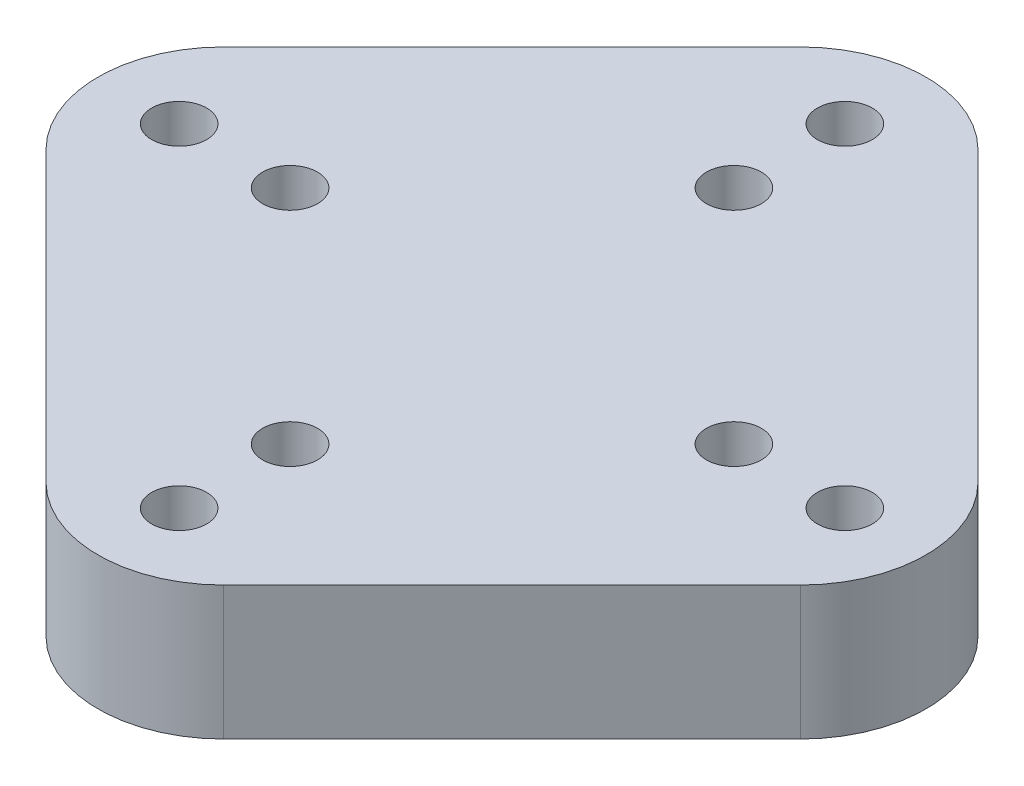
ISO-10303-21;
HEADER;
FILE_DESCRIPTION(('STEP AP214'),'2;1');
FILE_NAME('part.step','',(''),(''),'','','');
FILE_SCHEMA(('AUTOMOTIVE_DESIGN { 1 0 10303 214 1 1 1 1 }'));
ENDSEC;
DATA;
#1=APPLICATION_CONTEXT('core data for automotive mechanical design processes');
#2=APPLICATION_PROTOCOL_DEFINITION('international standard','automotive_design',2000,#1);
#3=PRODUCT_CONTEXT('',#1,'mechanical');
#4=PRODUCT('Part','Part','',(#3));
#5=PRODUCT_RELATED_PRODUCT_CATEGORY('part','',(#4));
#6=PRODUCT_DEFINITION_FORMATION('','',#4);
#7=PRODUCT_DEFINITION_CONTEXT('part definition',#1,'design');
#8=PRODUCT_DEFINITION('design','',#6,#7);
#9=PRODUCT_DEFINITION_SHAPE('','',#8);
#10=(LENGTH_UNIT() NAMED_UNIT(*) SI_UNIT(.MILLI.,.METRE.));
#11=(NAMED_UNIT(*) PLANE_ANGLE_UNIT() SI_UNIT($,.RADIAN.));
#12=(NAMED_UNIT(*) SI_UNIT($,.STERADIAN.) SOLID_ANGLE_UNIT());
#13=UNCERTAINTY_MEASURE_WITH_UNIT(LENGTH_MEASURE(1.E-05),#10,'distance_accuracy_value','');
#14=(GEOMETRIC_REPRESENTATION_CONTEXT(3) GLOBAL_UNCERTAINTY_ASSIGNED_CONTEXT((#13)) GLOBAL_UNIT_ASSIGNED_CONTEXT((#10,
#11,#12)) REPRESENTATION_CONTEXT('',''));
#15=CARTESIAN_POINT('',(0.,0.,0.));
#16=DIRECTION('',(0.,0.,1.));
#17=DIRECTION('',(1.,0.,0.));
#18=AXIS2_PLACEMENT_3D('',#15,#16,#17);
#19=CARTESIAN_POINT('',(18.3847763108502,8.5,0.));
#20=DIRECTION('',(0.,-1.,0.));
#21=DIRECTION('',(0.,0.,-1.));
#22=AXIS2_PLACEMENT_3D('',#19,#20,#21);
#23=PLANE('',#22);
#24=CARTESIAN_POINT('',(18.3847763108502,8.5,0.));
#25=DIRECTION('',(0.,1.,0.));
#26=DIRECTION('',(0.,0.,-1.));
#27=AXIS2_PLACEMENT_3D('',#24,#25,#26);
#28=CIRCLE('',#27,8.);
#29=CARTESIAN_POINT('',(24.0416305603426,8.5,5.65685424949242));
#30=VERTEX_POINT('',#29);
#31=CARTESIAN_POINT('',(24.0416305603426,8.5,-5.65685424949242));
#32=VERTEX_POINT('',#31);
#33=EDGE_CURVE('E148',#30,#32,#28,.T.);
#34=ORIENTED_EDGE('',*,*,#33,.T.);
#35=DIRECTION('',(-0.707106781186548,0.,-0.707106781186547));
#36=VECTOR('',#35,1.);
#37=CARTESIAN_POINT('',(24.0416305603426,8.5,-5.65685424949242));
#38=LINE('',#37,#36);
#39=CARTESIAN_POINT('',(5.65685424949241,8.5,-24.0416305603426));
#40=VERTEX_POINT('',#39);
#41=EDGE_CURVE('E96',#32,#40,#38,.T.);
#42=ORIENTED_EDGE('',*,*,#41,.T.);
#43=CARTESIAN_POINT('',(0.,8.5,-18.3847763108502));
#44=DIRECTION('',(0.,1.,0.));
#45=DIRECTION('',(0.,0.,-1.));
#46=AXIS2_PLACEMENT_3D('',#43,#44,#45);
#47=CIRCLE('',#46,8.);
#48=CARTESIAN_POINT('',(-5.65685424949243,8.5,-24.0416305603426));
#49=VERTEX_POINT('',#48);
#50=EDGE_CURVE('E163',#40,#49,#47,.T.);
#51=ORIENTED_EDGE('',*,*,#50,.T.);
#52=DIRECTION('',(-0.707106781186547,0.,0.707106781186548));
#53=VECTOR('',#52,1.);
#54=CARTESIAN_POINT('',(-5.65685424949243,8.5,-24.0416305603426));
#55=LINE('',#54,#53);
#56=CARTESIAN_POINT('',(-24.0416305603426,8.5,-5.65685424949241));
#57=VERTEX_POINT('',#56);
#58=EDGE_CURVE('E176',#49,#57,#55,.T.);
#59=ORIENTED_EDGE('',*,*,#58,.T.);
#60=CARTESIAN_POINT('',(-18.3847763108502,8.5,0.));
#61=DIRECTION('',(0.,1.,0.));
#62=DIRECTION('',(0.,0.,-1.));
#63=AXIS2_PLACEMENT_3D('',#60,#61,#62);
#64=CIRCLE('',#63,8.);
#65=CARTESIAN_POINT('',(-24.0416305603426,8.5,5.65685424949243));
#66=VERTEX_POINT('',#65);
#67=EDGE_CURVE('E115',#57,#66,#64,.T.);
#68=ORIENTED_EDGE('',*,*,#67,.T.);
#69=DIRECTION('',(0.707106781186548,0.,0.707106781186547));
#70=VECTOR('',#69,1.);
#71=CARTESIAN_POINT('',(-24.0416305603426,8.5,5.65685424949243));
#72=LINE('',#71,#70);
#73=CARTESIAN_POINT('',(-5.65685424949241,8.5,24.0416305603426));
#74=VERTEX_POINT('',#73);
#75=EDGE_CURVE('E109',#66,#74,#72,.T.);
#76=ORIENTED_EDGE('',*,*,#75,.T.);
#77=CARTESIAN_POINT('',(0.,8.5,18.3847763108502));
#78=DIRECTION('',(0.,1.,0.));
#79=DIRECTION('',(0.,0.,-1.));
#80=AXIS2_PLACEMENT_3D('',#77,#78,#79);
#81=CIRCLE('',#80,8.);
#82=CARTESIAN_POINT('',(5.65685424949243,8.5,24.0416305603426));
#83=VERTEX_POINT('',#82);
#84=EDGE_CURVE('E113',#74,#83,#81,.T.);
#85=ORIENTED_EDGE('',*,*,#84,.T.);
#86=DIRECTION('',(0.707106781186547,0.,-0.707106781186548));
#87=VECTOR('',#86,1.);
#88=CARTESIAN_POINT('',(5.65685424949243,8.5,24.0416305603426));
#89=LINE('',#88,#87);
#90=EDGE_CURVE('E53',#83,#30,#89,.T.);
#91=ORIENTED_EDGE('',*,*,#90,.T.);
#92=EDGE_LOOP('',(#34,#42,#51,#59,#68,#76,#85,#91));
#93=FACE_BOUND('',#92,.T.);
#94=CARTESIAN_POINT('',(21.2132034355964,8.5,0.));
#95=DIRECTION('',(0.,1.,0.));
#96=DIRECTION('',(0.,0.,1.));
#97=AXIS2_PLACEMENT_3D('',#94,#95,#96);
#98=CIRCLE('',#97,1.75);
#99=CARTESIAN_POINT('',(21.2132034355964,8.5,1.75));
#100=VERTEX_POINT('',#99);
#101=EDGE_CURVE('E137',#100,#100,#98,.T.);
#102=ORIENTED_EDGE('',*,*,#101,.F.);
#103=EDGE_LOOP('',(#102));
#104=FACE_BOUND('',#103,.T.);
#105=CARTESIAN_POINT('',(14.142135623731,8.5,0.));
#106=DIRECTION('',(0.,1.,0.));
#107=DIRECTION('',(0.,0.,1.));
#108=AXIS2_PLACEMENT_3D('',#105,#106,#107);
#109=CIRCLE('',#108,1.75);
#110=CARTESIAN_POINT('',(14.142135623731,8.5,1.75));
#111=VERTEX_POINT('',#110);
#112=EDGE_CURVE('E185',#111,#111,#109,.T.);
#113=ORIENTED_EDGE('',*,*,#112,.F.);
#114=EDGE_LOOP('',(#113));
#115=FACE_BOUND('',#114,.T.);
#116=CARTESIAN_POINT('',(0.,8.5,21.2132034355964));
#117=DIRECTION('',(0.,1.,0.));
#118=DIRECTION('',(0.,0.,1.));
#119=AXIS2_PLACEMENT_3D('',#116,#117,#118);
#120=CIRCLE('',#119,1.75);
#121=CARTESIAN_POINT('',(0.,8.5,22.9632034355964));
#122=VERTEX_POINT('',#121);
#123=EDGE_CURVE('E191',#122,#122,#120,.T.);
#124=ORIENTED_EDGE('',*,*,#123,.F.);
#125=EDGE_LOOP('',(#124));
#126=FACE_BOUND('',#125,.T.);
#127=CARTESIAN_POINT('',(0.,8.5,14.142135623731));
#128=DIRECTION('',(0.,1.,0.));
#129=DIRECTION('',(0.,0.,1.));
#130=AXIS2_PLACEMENT_3D('',#127,#128,#129);
#131=CIRCLE('',#130,1.75);
#132=CARTESIAN_POINT('',(0.,8.5,15.892135623731));
#133=VERTEX_POINT('',#132);
#134=EDGE_CURVE('E197',#133,#133,#131,.T.);
#135=ORIENTED_EDGE('',*,*,#134,.F.);
#136=EDGE_LOOP('',(#135));
#137=FACE_BOUND('',#136,.T.);
#138=CARTESIAN_POINT('',(-21.2132034355964,8.5,0.));
#139=DIRECTION('',(0.,1.,0.));
#140=DIRECTION('',(0.,0.,1.));
#141=AXIS2_PLACEMENT_3D('',#138,#139,#140);
#142=CIRCLE('',#141,1.75);
#143=CARTESIAN_POINT('',(-21.2132034355964,8.5,1.75));
#144=VERTEX_POINT('',#143);
#145=EDGE_CURVE('E203',#144,#144,#142,.T.);
#146=ORIENTED_EDGE('',*,*,#145,.F.);
#147=EDGE_LOOP('',(#146));
#148=FACE_BOUND('',#147,.T.);
#149=CARTESIAN_POINT('',(-14.142135623731,8.5,0.));
#150=DIRECTION('',(0.,1.,0.));
#151=DIRECTION('',(0.,0.,1.));
#152=AXIS2_PLACEMENT_3D('',#149,#150,#151);
#153=CIRCLE('',#152,1.75);
#154=CARTESIAN_POINT('',(-14.142135623731,8.5,1.75));
#155=VERTEX_POINT('',#154);
#156=EDGE_CURVE('E209',#155,#155,#153,.T.);
#157=ORIENTED_EDGE('',*,*,#156,.F.);
#158=EDGE_LOOP('',(#157));
#159=FACE_BOUND('',#158,.T.);
#160=CARTESIAN_POINT('',(0.,8.5,-21.2132034355964));
#161=DIRECTION('',(0.,1.,0.));
#162=DIRECTION('',(0.,0.,1.));
#163=AXIS2_PLACEMENT_3D('',#160,#161,#162);
#164=CIRCLE('',#163,1.75);
#165=CARTESIAN_POINT('',(0.,8.5,-19.4632034355964));
#166=VERTEX_POINT('',#165);
#167=EDGE_CURVE('E215',#166,#166,#164,.T.);
#168=ORIENTED_EDGE('',*,*,#167,.F.);
#169=EDGE_LOOP('',(#168));
#170=FACE_BOUND('',#169,.T.);
#171=CARTESIAN_POINT('',(0.,8.5,-14.142135623731));
#172=DIRECTION('',(0.,1.,0.));
#173=DIRECTION('',(0.,0.,1.));
#174=AXIS2_PLACEMENT_3D('',#171,#172,#173);
#175=CIRCLE('',#174,1.75);
#176=CARTESIAN_POINT('',(0.,8.5,-12.392135623731));
#177=VERTEX_POINT('',#176);
#178=EDGE_CURVE('E221',#177,#177,#175,.T.);
#179=ORIENTED_EDGE('',*,*,#178,.F.);
#180=EDGE_LOOP('',(#179));
#181=FACE_BOUND('',#180,.T.);
#182=ADVANCED_FACE('F36',(#93,#104,#115,#126,#137,#148,#159,#170,#181),#23,.F.);
#183=CARTESIAN_POINT('',(18.3847763108502,0.,0.));
#184=DIRECTION('',(0.,-1.,0.));
#185=DIRECTION('',(0.,0.,-1.));
#186=AXIS2_PLACEMENT_3D('',#183,#184,#185);
#187=PLANE('',#186);
#188=CARTESIAN_POINT('',(0.,0.,-21.2132034355964));
#189=DIRECTION('',(0.,1.,0.));
#190=DIRECTION('',(0.,0.,1.));
#191=AXIS2_PLACEMENT_3D('',#188,#189,#190);
#192=CIRCLE('',#191,1.75);
#193=CARTESIAN_POINT('',(0.,0.,-19.4632034355964));
#194=VERTEX_POINT('',#193);
#195=EDGE_CURVE('E218',#194,#194,#192,.T.);
#196=ORIENTED_EDGE('',*,*,#195,.T.);
#197=EDGE_LOOP('',(#196));
#198=FACE_BOUND('',#197,.T.);
#199=CARTESIAN_POINT('',(-21.2132034355964,0.,0.));
#200=DIRECTION('',(0.,1.,0.));
#201=DIRECTION('',(0.,0.,1.));
#202=AXIS2_PLACEMENT_3D('',#199,#200,#201);
#203=CIRCLE('',#202,1.75);
#204=CARTESIAN_POINT('',(-21.2132034355964,0.,1.75));
#205=VERTEX_POINT('',#204);
#206=EDGE_CURVE('E206',#205,#205,#203,.T.);
#207=ORIENTED_EDGE('',*,*,#206,.T.);
#208=EDGE_LOOP('',(#207));
#209=FACE_BOUND('',#208,.T.);
#210=CARTESIAN_POINT('',(0.,0.,21.2132034355964));
#211=DIRECTION('',(0.,1.,0.));
#212=DIRECTION('',(0.,0.,1.));
#213=AXIS2_PLACEMENT_3D('',#210,#211,#212);
#214=CIRCLE('',#213,1.75);
#215=CARTESIAN_POINT('',(0.,0.,22.9632034355964));
#216=VERTEX_POINT('',#215);
#217=EDGE_CURVE('E194',#216,#216,#214,.T.);
#218=ORIENTED_EDGE('',*,*,#217,.T.);
#219=EDGE_LOOP('',(#218));
#220=FACE_BOUND('',#219,.T.);
#221=CARTESIAN_POINT('',(21.2132034355964,0.,0.));
#222=DIRECTION('',(0.,1.,0.));
#223=DIRECTION('',(0.,0.,1.));
#224=AXIS2_PLACEMENT_3D('',#221,#222,#223);
#225=CIRCLE('',#224,1.75);
#226=CARTESIAN_POINT('',(21.2132034355964,0.,1.75));
#227=VERTEX_POINT('',#226);
#228=EDGE_CURVE('E182',#227,#227,#225,.T.);
#229=ORIENTED_EDGE('',*,*,#228,.T.);
#230=EDGE_LOOP('',(#229));
#231=FACE_BOUND('',#230,.T.);
#232=CARTESIAN_POINT('',(18.3847763108502,0.,0.));
#233=DIRECTION('',(0.,1.,0.));
#234=DIRECTION('',(0.,0.,-1.));
#235=AXIS2_PLACEMENT_3D('',#232,#233,#234);
#236=CIRCLE('',#235,8.);
#237=CARTESIAN_POINT('',(24.0416305603426,0.,5.65685424949242));
#238=VERTEX_POINT('',#237);
#239=CARTESIAN_POINT('',(24.0416305603426,0.,-5.65685424949242));
#240=VERTEX_POINT('',#239);
#241=EDGE_CURVE('E133',#238,#240,#236,.T.);
#242=ORIENTED_EDGE('',*,*,#241,.F.);
#243=DIRECTION('',(0.707106781186547,0.,-0.707106781186548));
#244=VECTOR('',#243,1.);
#245=CARTESIAN_POINT('',(5.65685424949243,0.,24.0416305603426));
#246=LINE('',#245,#244);
#247=CARTESIAN_POINT('',(5.65685424949243,0.,24.0416305603426));
#248=VERTEX_POINT('',#247);
#249=EDGE_CURVE('E88',#248,#238,#246,.T.);
#250=ORIENTED_EDGE('',*,*,#249,.F.);
#251=CARTESIAN_POINT('',(0.,0.,18.3847763108502));
#252=DIRECTION('',(0.,1.,0.));
#253=DIRECTION('',(0.,0.,-1.));
#254=AXIS2_PLACEMENT_3D('',#251,#252,#253);
#255=CIRCLE('',#254,8.);
#256=CARTESIAN_POINT('',(-5.65685424949241,0.,24.0416305603426));
#257=VERTEX_POINT('',#256);
#258=EDGE_CURVE('E82',#257,#248,#255,.T.);
#259=ORIENTED_EDGE('',*,*,#258,.F.);
#260=DIRECTION('',(0.707106781186548,0.,0.707106781186547));
#261=VECTOR('',#260,1.);
#262=CARTESIAN_POINT('',(-24.0416305603426,0.,5.65685424949243));
#263=LINE('',#262,#261);
#264=CARTESIAN_POINT('',(-24.0416305603426,0.,5.65685424949243));
#265=VERTEX_POINT('',#264);
#266=EDGE_CURVE('E123',#265,#257,#263,.T.);
#267=ORIENTED_EDGE('',*,*,#266,.F.);
#268=CARTESIAN_POINT('',(-18.3847763108502,0.,0.));
#269=DIRECTION('',(0.,1.,0.));
#270=DIRECTION('',(0.,0.,-1.));
#271=AXIS2_PLACEMENT_3D('',#268,#269,#270);
#272=CIRCLE('',#271,8.);
#273=CARTESIAN_POINT('',(-24.0416305603426,0.,-5.65685424949241));
#274=VERTEX_POINT('',#273);
#275=EDGE_CURVE('E143',#274,#265,#272,.T.);
#276=ORIENTED_EDGE('',*,*,#275,.F.);
#277=DIRECTION('',(-0.707106781186547,0.,0.707106781186548));
#278=VECTOR('',#277,1.);
#279=CARTESIAN_POINT('',(-5.65685424949243,0.,-24.0416305603426));
#280=LINE('',#279,#278);
#281=CARTESIAN_POINT('',(-5.65685424949243,0.,-24.0416305603426));
#282=VERTEX_POINT('',#281);
#283=EDGE_CURVE('E141',#282,#274,#280,.T.);
#284=ORIENTED_EDGE('',*,*,#283,.F.);
#285=CARTESIAN_POINT('',(0.,0.,-18.3847763108502));
#286=DIRECTION('',(0.,1.,0.));
#287=DIRECTION('',(0.,0.,-1.));
#288=AXIS2_PLACEMENT_3D('',#285,#286,#287);
#289=CIRCLE('',#288,8.);
#290=CARTESIAN_POINT('',(5.65685424949241,0.,-24.0416305603426));
#291=VERTEX_POINT('',#290);
#292=EDGE_CURVE('E139',#291,#282,#289,.T.);
#293=ORIENTED_EDGE('',*,*,#292,.F.);
#294=DIRECTION('',(-0.707106781186548,0.,-0.707106781186547));
#295=VECTOR('',#294,1.);
#296=CARTESIAN_POINT('',(24.0416305603426,0.,-5.65685424949242));
#297=LINE('',#296,#295);
#298=EDGE_CURVE('E136',#240,#291,#297,.T.);
#299=ORIENTED_EDGE('',*,*,#298,.F.);
#300=EDGE_LOOP('',(#242,#250,#259,#267,#276,#284,#293,#299));
#301=FACE_BOUND('',#300,.T.);
#302=CARTESIAN_POINT('',(14.142135623731,0.,0.));
#303=DIRECTION('',(0.,1.,0.));
#304=DIRECTION('',(0.,0.,1.));
#305=AXIS2_PLACEMENT_3D('',#302,#303,#304);
#306=CIRCLE('',#305,1.75);
#307=CARTESIAN_POINT('',(14.142135623731,0.,1.75));
#308=VERTEX_POINT('',#307);
#309=EDGE_CURVE('E188',#308,#308,#306,.T.);
#310=ORIENTED_EDGE('',*,*,#309,.T.);
#311=EDGE_LOOP('',(#310));
#312=FACE_BOUND('',#311,.T.);
#313=CARTESIAN_POINT('',(0.,0.,14.142135623731));
#314=DIRECTION('',(0.,1.,0.));
#315=DIRECTION('',(0.,0.,1.));
#316=AXIS2_PLACEMENT_3D('',#313,#314,#315);
#317=CIRCLE('',#316,1.75);
#318=CARTESIAN_POINT('',(0.,0.,15.892135623731));
#319=VERTEX_POINT('',#318);
#320=EDGE_CURVE('E200',#319,#319,#317,.T.);
#321=ORIENTED_EDGE('',*,*,#320,.T.);
#322=EDGE_LOOP('',(#321));
#323=FACE_BOUND('',#322,.T.);
#324=CARTESIAN_POINT('',(-14.142135623731,0.,0.));
#325=DIRECTION('',(0.,1.,0.));
#326=DIRECTION('',(0.,0.,1.));
#327=AXIS2_PLACEMENT_3D('',#324,#325,#326);
#328=CIRCLE('',#327,1.75);
#329=CARTESIAN_POINT('',(-14.142135623731,0.,1.75));
#330=VERTEX_POINT('',#329);
#331=EDGE_CURVE('E212',#330,#330,#328,.T.);
#332=ORIENTED_EDGE('',*,*,#331,.T.);
#333=EDGE_LOOP('',(#332));
#334=FACE_BOUND('',#333,.T.);
#335=CARTESIAN_POINT('',(0.,0.,-14.142135623731));
#336=DIRECTION('',(0.,1.,0.));
#337=DIRECTION('',(0.,0.,1.));
#338=AXIS2_PLACEMENT_3D('',#335,#336,#337);
#339=CIRCLE('',#338,1.75);
#340=CARTESIAN_POINT('',(0.,0.,-12.392135623731));
#341=VERTEX_POINT('',#340);
#342=EDGE_CURVE('E224',#341,#341,#339,.T.);
#343=ORIENTED_EDGE('',*,*,#342,.T.);
#344=EDGE_LOOP('',(#343));
#345=FACE_BOUND('',#344,.T.);
#346=ADVANCED_FACE('F167',(#198,#209,#220,#231,#301,#312,#323,#334,#345),#187,.T.);
#347=CARTESIAN_POINT('',(18.3847763108502,8.5,0.));
#348=DIRECTION('',(0.,-1.,0.));
#349=DIRECTION('',(0.,0.,-1.));
#350=AXIS2_PLACEMENT_3D('',#347,#348,#349);
#351=CYLINDRICAL_SURFACE('',#350,8.);
#352=ORIENTED_EDGE('',*,*,#241,.T.);
#353=DIRECTION('',(0.,-1.,0.));
#354=VECTOR('',#353,1.);
#355=CARTESIAN_POINT('',(24.0416305603426,8.5,-5.65685424949242));
#356=LINE('',#355,#354);
#357=EDGE_CURVE('E11',#32,#240,#356,.T.);
#358=ORIENTED_EDGE('',*,*,#357,.F.);
#359=ORIENTED_EDGE('',*,*,#33,.F.);
#360=DIRECTION('',(0.,-1.,0.));
#361=VECTOR('',#360,1.);
#362=CARTESIAN_POINT('',(24.0416305603426,8.5,5.65685424949242));
#363=LINE('',#362,#361);
#364=EDGE_CURVE('E129',#30,#238,#363,.T.);
#365=ORIENTED_EDGE('',*,*,#364,.T.);
#366=EDGE_LOOP('',(#352,#358,#359,#365));
#367=FACE_BOUND('',#366,.T.);
#368=ADVANCED_FACE('F38',(#367),#351,.T.);
#369=CARTESIAN_POINT('',(24.0416305603426,8.5,-5.65685424949242));
#370=DIRECTION('',(-0.707106781186547,0.,0.707106781186548));
#371=DIRECTION('',(0.707106781186548,0.,0.707106781186547));
#372=AXIS2_PLACEMENT_3D('',#369,#370,#371);
#373=PLANE('',#372);
#374=ORIENTED_EDGE('',*,*,#298,.T.);
#375=DIRECTION('',(0.,-1.,0.));
#376=VECTOR('',#375,1.);
#377=CARTESIAN_POINT('',(5.65685424949241,8.5,-24.0416305603426));
#378=LINE('',#377,#376);
#379=EDGE_CURVE('E45',#40,#291,#378,.T.);
#380=ORIENTED_EDGE('',*,*,#379,.F.);
#381=ORIENTED_EDGE('',*,*,#41,.F.);
#382=ORIENTED_EDGE('',*,*,#357,.T.);
#383=EDGE_LOOP('',(#374,#380,#381,#382));
#384=FACE_BOUND('',#383,.T.);
#385=ADVANCED_FACE('F256',(#384),#373,.F.);
#386=CARTESIAN_POINT('',(0.,8.5,-18.3847763108502));
#387=DIRECTION('',(0.,-1.,0.));
#388=DIRECTION('',(0.,0.,-1.));
#389=AXIS2_PLACEMENT_3D('',#386,#387,#388);
#390=CYLINDRICAL_SURFACE('',#389,8.);
#391=ORIENTED_EDGE('',*,*,#292,.T.);
#392=DIRECTION('',(0.,-1.,0.));
#393=VECTOR('',#392,1.);
#394=CARTESIAN_POINT('',(-5.65685424949243,8.5,-24.0416305603426));
#395=LINE('',#394,#393);
#396=EDGE_CURVE('E155',#49,#282,#395,.T.);
#397=ORIENTED_EDGE('',*,*,#396,.F.);
#398=ORIENTED_EDGE('',*,*,#50,.F.);
#399=ORIENTED_EDGE('',*,*,#379,.T.);
#400=EDGE_LOOP('',(#391,#397,#398,#399));
#401=FACE_BOUND('',#400,.T.);
#402=ADVANCED_FACE('F161',(#401),#390,.T.);
#403=CARTESIAN_POINT('',(-5.65685424949243,8.5,-24.0416305603426));
#404=DIRECTION('',(0.707106781186548,0.,0.707106781186547));
#405=DIRECTION('',(0.707106781186547,0.,-0.707106781186548));
#406=AXIS2_PLACEMENT_3D('',#403,#404,#405);
#407=PLANE('',#406);
#408=ORIENTED_EDGE('',*,*,#283,.T.);
#409=DIRECTION('',(0.,-1.,0.));
#410=VECTOR('',#409,1.);
#411=CARTESIAN_POINT('',(-24.0416305603426,8.5,-5.65685424949241));
#412=LINE('',#411,#410);
#413=EDGE_CURVE('E152',#57,#274,#412,.T.);
#414=ORIENTED_EDGE('',*,*,#413,.F.);
#415=ORIENTED_EDGE('',*,*,#58,.F.);
#416=ORIENTED_EDGE('',*,*,#396,.T.);
#417=EDGE_LOOP('',(#408,#414,#415,#416));
#418=FACE_BOUND('',#417,.T.);
#419=ADVANCED_FACE('F172',(#418),#407,.F.);
#420=CARTESIAN_POINT('',(-18.3847763108502,8.5,0.));
#421=DIRECTION('',(0.,-1.,0.));
#422=DIRECTION('',(0.,0.,-1.));
#423=AXIS2_PLACEMENT_3D('',#420,#421,#422);
#424=CYLINDRICAL_SURFACE('',#423,8.);
#425=ORIENTED_EDGE('',*,*,#275,.T.);
#426=DIRECTION('',(0.,-1.,0.));
#427=VECTOR('',#426,1.);
#428=CARTESIAN_POINT('',(-24.0416305603426,8.5,5.65685424949243));
#429=LINE('',#428,#427);
#430=EDGE_CURVE('E124',#66,#265,#429,.T.);
#431=ORIENTED_EDGE('',*,*,#430,.F.);
#432=ORIENTED_EDGE('',*,*,#67,.F.);
#433=ORIENTED_EDGE('',*,*,#413,.T.);
#434=EDGE_LOOP('',(#425,#431,#432,#433));
#435=FACE_BOUND('',#434,.T.);
#436=ADVANCED_FACE('F175',(#435),#424,.T.);
#437=CARTESIAN_POINT('',(-24.0416305603426,8.5,5.65685424949243));
#438=DIRECTION('',(0.707106781186547,0.,-0.707106781186548));
#439=DIRECTION('',(-0.707106781186548,0.,-0.707106781186547));
#440=AXIS2_PLACEMENT_3D('',#437,#438,#439);
#441=PLANE('',#440);
#442=ORIENTED_EDGE('',*,*,#266,.T.);
#443=DIRECTION('',(0.,-1.,0.));
#444=VECTOR('',#443,1.);
#445=CARTESIAN_POINT('',(-5.65685424949241,8.5,24.0416305603426));
#446=LINE('',#445,#444);
#447=EDGE_CURVE('E120',#74,#257,#446,.T.);
#448=ORIENTED_EDGE('',*,*,#447,.F.);
#449=ORIENTED_EDGE('',*,*,#75,.F.);
#450=ORIENTED_EDGE('',*,*,#430,.T.);
#451=EDGE_LOOP('',(#442,#448,#449,#450));
#452=FACE_BOUND('',#451,.T.);
#453=ADVANCED_FACE('F121',(#452),#441,.F.);
#454=CARTESIAN_POINT('',(0.,8.5,18.3847763108502));
#455=DIRECTION('',(0.,-1.,0.));
#456=DIRECTION('',(0.,0.,-1.));
#457=AXIS2_PLACEMENT_3D('',#454,#455,#456);
#458=CYLINDRICAL_SURFACE('',#457,8.);
#459=ORIENTED_EDGE('',*,*,#258,.T.);
#460=DIRECTION('',(0.,-1.,0.));
#461=VECTOR('',#460,1.);
#462=CARTESIAN_POINT('',(5.65685424949243,8.5,24.0416305603426));
#463=LINE('',#462,#461);
#464=EDGE_CURVE('E125',#83,#248,#463,.T.);
#465=ORIENTED_EDGE('',*,*,#464,.F.);
#466=ORIENTED_EDGE('',*,*,#84,.F.);
#467=ORIENTED_EDGE('',*,*,#447,.T.);
#468=EDGE_LOOP('',(#459,#465,#466,#467));
#469=FACE_BOUND('',#468,.T.);
#470=ADVANCED_FACE('F127',(#469),#458,.T.);
#471=CARTESIAN_POINT('',(5.65685424949243,8.5,24.0416305603426));
#472=DIRECTION('',(-0.707106781186548,0.,-0.707106781186547));
#473=DIRECTION('',(-0.707106781186547,0.,0.707106781186548));
#474=AXIS2_PLACEMENT_3D('',#471,#472,#473);
#475=PLANE('',#474);
#476=ORIENTED_EDGE('',*,*,#249,.T.);
#477=ORIENTED_EDGE('',*,*,#364,.F.);
#478=ORIENTED_EDGE('',*,*,#90,.F.);
#479=ORIENTED_EDGE('',*,*,#464,.T.);
#480=EDGE_LOOP('',(#476,#477,#478,#479));
#481=FACE_BOUND('',#480,.T.);
#482=ADVANCED_FACE('F244',(#481),#475,.F.);
#483=CARTESIAN_POINT('',(21.2132034355964,8.5,0.));
#484=DIRECTION('',(0.,-1.,0.));
#485=DIRECTION('',(0.,0.,-1.));
#486=AXIS2_PLACEMENT_3D('',#483,#484,#485);
#487=CYLINDRICAL_SURFACE('',#486,1.75);
#488=ORIENTED_EDGE('',*,*,#101,.T.);
#489=EDGE_LOOP('',(#488));
#490=FACE_BOUND('',#489,.T.);
#491=ORIENTED_EDGE('',*,*,#228,.F.);
#492=EDGE_LOOP('',(#491));
#493=FACE_BOUND('',#492,.T.);
#494=ADVANCED_FACE('F241',(#490,#493),#487,.F.);
#495=CARTESIAN_POINT('',(14.142135623731,8.5,0.));
#496=DIRECTION('',(0.,-1.,0.));
#497=DIRECTION('',(0.,0.,-1.));
#498=AXIS2_PLACEMENT_3D('',#495,#496,#497);
#499=CYLINDRICAL_SURFACE('',#498,1.75);
#500=ORIENTED_EDGE('',*,*,#112,.T.);
#501=EDGE_LOOP('',(#500));
#502=FACE_BOUND('',#501,.T.);
#503=ORIENTED_EDGE('',*,*,#309,.F.);
#504=EDGE_LOOP('',(#503));
#505=FACE_BOUND('',#504,.T.);
#506=ADVANCED_FACE('F320',(#502,#505),#499,.F.);
#507=CARTESIAN_POINT('',(0.,8.5,21.2132034355964));
#508=DIRECTION('',(0.,-1.,0.));
#509=DIRECTION('',(0.,0.,-1.));
#510=AXIS2_PLACEMENT_3D('',#507,#508,#509);
#511=CYLINDRICAL_SURFACE('',#510,1.75);
#512=ORIENTED_EDGE('',*,*,#123,.T.);
#513=EDGE_LOOP('',(#512));
#514=FACE_BOUND('',#513,.T.);
#515=ORIENTED_EDGE('',*,*,#217,.F.);
#516=EDGE_LOOP('',(#515));
#517=FACE_BOUND('',#516,.T.);
#518=ADVANCED_FACE('F328',(#514,#517),#511,.F.);
#519=CARTESIAN_POINT('',(0.,8.5,14.142135623731));
#520=DIRECTION('',(0.,-1.,0.));
#521=DIRECTION('',(0.,0.,-1.));
#522=AXIS2_PLACEMENT_3D('',#519,#520,#521);
#523=CYLINDRICAL_SURFACE('',#522,1.75);
#524=ORIENTED_EDGE('',*,*,#134,.T.);
#525=EDGE_LOOP('',(#524));
#526=FACE_BOUND('',#525,.T.);
#527=ORIENTED_EDGE('',*,*,#320,.F.);
#528=EDGE_LOOP('',(#527));
#529=FACE_BOUND('',#528,.T.);
#530=ADVANCED_FACE('F336',(#526,#529),#523,.F.);
#531=CARTESIAN_POINT('',(-21.2132034355964,8.5,0.));
#532=DIRECTION('',(0.,-1.,0.));
#533=DIRECTION('',(0.,0.,-1.));
#534=AXIS2_PLACEMENT_3D('',#531,#532,#533);
#535=CYLINDRICAL_SURFACE('',#534,1.75);
#536=ORIENTED_EDGE('',*,*,#145,.T.);
#537=EDGE_LOOP('',(#536));
#538=FACE_BOUND('',#537,.T.);
#539=ORIENTED_EDGE('',*,*,#206,.F.);
#540=EDGE_LOOP('',(#539));
#541=FACE_BOUND('',#540,.T.);
#542=ADVANCED_FACE('F345',(#538,#541),#535,.F.);
#543=CARTESIAN_POINT('',(-14.142135623731,8.5,0.));
#544=DIRECTION('',(0.,-1.,0.));
#545=DIRECTION('',(0.,0.,-1.));
#546=AXIS2_PLACEMENT_3D('',#543,#544,#545);
#547=CYLINDRICAL_SURFACE('',#546,1.75);
#548=ORIENTED_EDGE('',*,*,#156,.T.);
#549=EDGE_LOOP('',(#548));
#550=FACE_BOUND('',#549,.T.);
#551=ORIENTED_EDGE('',*,*,#331,.F.);
#552=EDGE_LOOP('',(#551));
#553=FACE_BOUND('',#552,.T.);
#554=ADVANCED_FACE('F354',(#550,#553),#547,.F.);
#555=CARTESIAN_POINT('',(0.,8.5,-21.2132034355964));
#556=DIRECTION('',(0.,-1.,0.));
#557=DIRECTION('',(0.,0.,-1.));
#558=AXIS2_PLACEMENT_3D('',#555,#556,#557);
#559=CYLINDRICAL_SURFACE('',#558,1.75);
#560=ORIENTED_EDGE('',*,*,#167,.T.);
#561=EDGE_LOOP('',(#560));
#562=FACE_BOUND('',#561,.T.);
#563=ORIENTED_EDGE('',*,*,#195,.F.);
#564=EDGE_LOOP('',(#563));
#565=FACE_BOUND('',#564,.T.);
#566=ADVANCED_FACE('F363',(#562,#565),#559,.F.);
#567=CARTESIAN_POINT('',(0.,8.5,-14.142135623731));
#568=DIRECTION('',(0.,-1.,0.));
#569=DIRECTION('',(0.,0.,-1.));
#570=AXIS2_PLACEMENT_3D('',#567,#568,#569);
#571=CYLINDRICAL_SURFACE('',#570,1.75);
#572=ORIENTED_EDGE('',*,*,#178,.T.);
#573=EDGE_LOOP('',(#572));
#574=FACE_BOUND('',#573,.T.);
#575=ORIENTED_EDGE('',*,*,#342,.F.);
#576=EDGE_LOOP('',(#575));
#577=FACE_BOUND('',#576,.T.);
#578=ADVANCED_FACE('F230',(#574,#577),#571,.F.);
#579=CLOSED_SHELL('',(#182,#346,#368,#385,#402,#419,#436,#453,#470,#482,#494,#506,#518,#530,
#542,#554,#566,#578));
#580=MANIFOLD_SOLID_BREP('B2',#579);
#581=ADVANCED_BREP_SHAPE_REPRESENTATION('',(#18,#580),#14);
#582=SHAPE_DEFINITION_REPRESENTATION(#9,#581);
ENDSEC;
END-ISO-10303-21;
